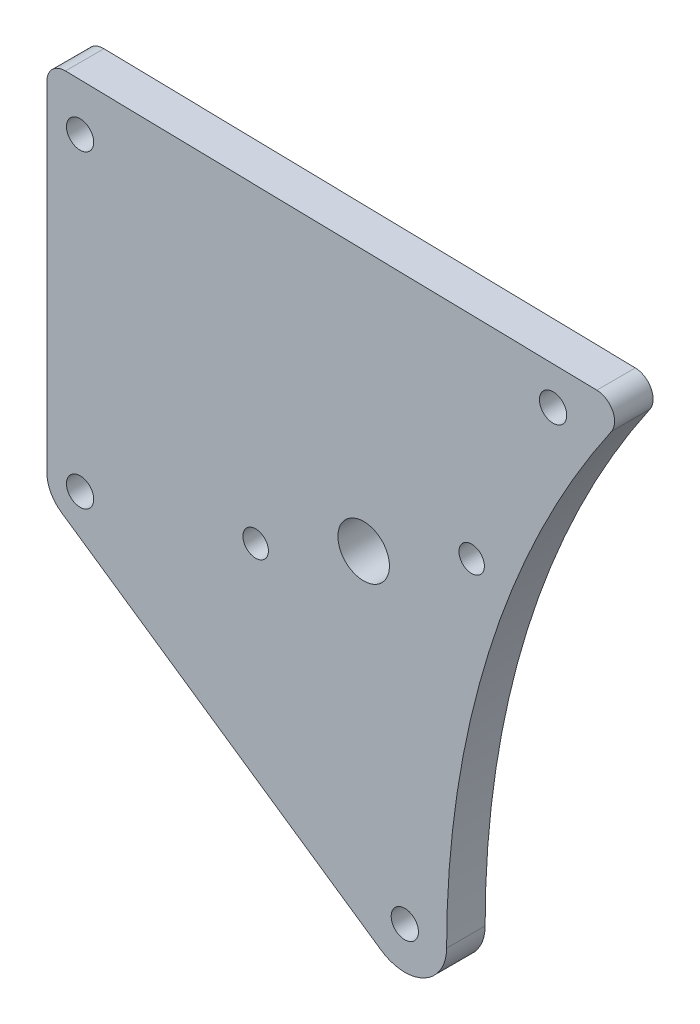
ISO-10303-21;
HEADER;
FILE_DESCRIPTION(('STEP AP214'),'2;1');
FILE_NAME('part.step','',(''),(''),'','','');
FILE_SCHEMA(('AUTOMOTIVE_DESIGN { 1 0 10303 214 1 1 1 1 }'));
ENDSEC;
DATA;
#1=APPLICATION_CONTEXT('core data for automotive mechanical design processes');
#2=APPLICATION_PROTOCOL_DEFINITION('international standard','automotive_design',2000,#1);
#3=PRODUCT_CONTEXT('',#1,'mechanical');
#4=PRODUCT('Part','Part','',(#3));
#5=PRODUCT_RELATED_PRODUCT_CATEGORY('part','',(#4));
#6=PRODUCT_DEFINITION_FORMATION('','',#4);
#7=PRODUCT_DEFINITION_CONTEXT('part definition',#1,'design');
#8=PRODUCT_DEFINITION('design','',#6,#7);
#9=PRODUCT_DEFINITION_SHAPE('','',#8);
#10=(LENGTH_UNIT() NAMED_UNIT(*) SI_UNIT(.MILLI.,.METRE.));
#11=(NAMED_UNIT(*) PLANE_ANGLE_UNIT() SI_UNIT($,.RADIAN.));
#12=(NAMED_UNIT(*) SI_UNIT($,.STERADIAN.) SOLID_ANGLE_UNIT());
#13=UNCERTAINTY_MEASURE_WITH_UNIT(LENGTH_MEASURE(1.E-05),#10,'distance_accuracy_value','');
#14=(GEOMETRIC_REPRESENTATION_CONTEXT(3) GLOBAL_UNCERTAINTY_ASSIGNED_CONTEXT((#13)) GLOBAL_UNIT_ASSIGNED_CONTEXT((#10,
#11,#12)) REPRESENTATION_CONTEXT('',''));
#15=CARTESIAN_POINT('',(0.,0.,0.));
#16=DIRECTION('',(0.,0.,1.));
#17=DIRECTION('',(1.,0.,0.));
#18=AXIS2_PLACEMENT_3D('',#15,#16,#17);
#19=CARTESIAN_POINT('',(-216.986286007672,90.8582156499784,6.35));
#20=DIRECTION('',(0.,0.,1.));
#21=DIRECTION('',(1.,0.,0.));
#22=AXIS2_PLACEMENT_3D('',#19,#20,#21);
#23=PLANE('',#22);
#24=CARTESIAN_POINT('',(-136.51,86.,6.35));
#25=DIRECTION('',(0.,0.,1.));
#26=DIRECTION('',(1.,0.,0.));
#27=AXIS2_PLACEMENT_3D('',#24,#25,#26);
#28=CIRCLE('',#27,2.248);
#29=CARTESIAN_POINT('',(-134.262,86.,6.35));
#30=VERTEX_POINT('',#29);
#31=EDGE_CURVE('E203',#30,#30,#28,.T.);
#32=ORIENTED_EDGE('',*,*,#31,.F.);
#33=EDGE_LOOP('',(#32));
#34=FACE_BOUND('',#33,.T.);
#35=CARTESIAN_POINT('',(-214.51,35.,6.35));
#36=DIRECTION('',(0.,0.,1.));
#37=DIRECTION('',(1.,0.,0.));
#38=AXIS2_PLACEMENT_3D('',#35,#36,#37);
#39=CIRCLE('',#38,2.248);
#40=CARTESIAN_POINT('',(-212.262,35.,6.35));
#41=VERTEX_POINT('',#40);
#42=EDGE_CURVE('E191',#41,#41,#39,.T.);
#43=ORIENTED_EDGE('',*,*,#42,.F.);
#44=EDGE_LOOP('',(#43));
#45=FACE_BOUND('',#44,.T.);
#46=CARTESIAN_POINT('',(-149.938627554827,57.6753742058202,6.35));
#47=DIRECTION('',(0.,0.,1.));
#48=DIRECTION('',(1.,0.,0.));
#49=AXIS2_PLACEMENT_3D('',#46,#47,#48);
#50=CIRCLE('',#49,2.10000000000002);
#51=CARTESIAN_POINT('',(-147.838627554827,57.6753742058202,6.35));
#52=VERTEX_POINT('',#51);
#53=EDGE_CURVE('E179',#52,#52,#50,.T.);
#54=ORIENTED_EDGE('',*,*,#53,.F.);
#55=EDGE_LOOP('',(#54));
#56=FACE_BOUND('',#55,.T.);
#57=CARTESIAN_POINT('',(-216.986286007672,90.8582156499784,6.35));
#58=DIRECTION('',(0.,0.,1.));
#59=DIRECTION('',(1.,0.,0.));
#60=AXIS2_PLACEMENT_3D('',#57,#58,#59);
#61=CIRCLE('',#60,3.);
#62=CARTESIAN_POINT('',(-216.925548391098,93.857600743949,6.35));
#63=VERTEX_POINT('',#62);
#64=CARTESIAN_POINT('',(-219.986286007672,90.8582156499784,6.35));
#65=VERTEX_POINT('',#64);
#66=EDGE_CURVE('E142',#63,#65,#61,.T.);
#67=ORIENTED_EDGE('',*,*,#66,.T.);
#68=DIRECTION('',(0.,-1.,0.));
#69=VECTOR('',#68,1.);
#70=CARTESIAN_POINT('',(-219.986286007672,90.8582156499784,6.35));
#71=LINE('',#70,#69);
#72=CARTESIAN_POINT('',(-219.986286007672,35.,6.35));
#73=VERTEX_POINT('',#72);
#74=EDGE_CURVE('E90',#65,#73,#71,.T.);
#75=ORIENTED_EDGE('',*,*,#74,.T.);
#76=CARTESIAN_POINT('',(-214.51,35.,6.35));
#77=DIRECTION('',(0.,0.,1.));
#78=DIRECTION('',(1.,0.,0.));
#79=AXIS2_PLACEMENT_3D('',#76,#77,#78);
#80=CIRCLE('',#79,5.47628600767153);
#81=CARTESIAN_POINT('',(-217.606823935587,30.4834316179434,6.35));
#82=VERTEX_POINT('',#81);
#83=EDGE_CURVE('E157',#73,#82,#80,.T.);
#84=ORIENTED_EDGE('',*,*,#83,.T.);
#85=DIRECTION('',(0.824750273402356,-0.565497114513186,0.));
#86=VECTOR('',#85,1.);
#87=CARTESIAN_POINT('',(-164.857630570775,-5.68450624480277,6.35));
#88=LINE('',#87,#86);
#89=CARTESIAN_POINT('',(-164.857630570775,-5.68450624480277,6.35));
#90=VERTEX_POINT('',#89);
#91=EDGE_CURVE('E170',#82,#90,#88,.T.);
#92=ORIENTED_EDGE('',*,*,#91,.T.);
#93=CARTESIAN_POINT('',(-160.96,0.,6.35));
#94=DIRECTION('',(0.,0.,1.));
#95=DIRECTION('',(1.,0.,0.));
#96=AXIS2_PLACEMENT_3D('',#93,#94,#95);
#97=CIRCLE('',#96,6.89239692077018);
#98=CARTESIAN_POINT('',(-154.06760307923,0.,6.35));
#99=VERTEX_POINT('',#98);
#100=EDGE_CURVE('E109',#90,#99,#97,.T.);
#101=ORIENTED_EDGE('',*,*,#100,.T.);
#102=CARTESIAN_POINT('',(0.,3.74716311865027E-13,6.35));
#103=DIRECTION('',(0.,0.,-1.));
#104=DIRECTION('',(1.,0.,0.));
#105=AXIS2_PLACEMENT_3D('',#102,#103,#104);
#106=CIRCLE('',#105,154.06760307923);
#107=CARTESIAN_POINT('',(-126.890346886855,87.3822990399818,6.35));
#108=VERTEX_POINT('',#107);
#109=EDGE_CURVE('E103',#99,#108,#106,.T.);
#110=ORIENTED_EDGE('',*,*,#109,.T.);
#111=CARTESIAN_POINT('',(-129.361152124637,89.0838046899732,6.35));
#112=DIRECTION('',(0.,0.,1.));
#113=DIRECTION('',(1.,0.,0.));
#114=AXIS2_PLACEMENT_3D('',#111,#112,#113);
#115=CIRCLE('',#114,3.00000000000001);
#116=CARTESIAN_POINT('',(-129.300414508063,92.0831897839438,6.35));
#117=VERTEX_POINT('',#116);
#118=EDGE_CURVE('E107',#108,#117,#115,.T.);
#119=ORIENTED_EDGE('',*,*,#118,.T.);
#120=DIRECTION('',(-0.999795031323528,0.0202458721912746,0.));
#121=VECTOR('',#120,1.);
#122=CARTESIAN_POINT('',(-129.300414508063,92.0831897839438,6.35));
#123=LINE('',#122,#121);
#124=EDGE_CURVE('E47',#117,#63,#123,.T.);
#125=ORIENTED_EDGE('',*,*,#124,.T.);
#126=EDGE_LOOP('',(#67,#75,#84,#92,#101,#110,#119,#125));
#127=FACE_BOUND('',#126,.T.);
#128=CARTESIAN_POINT('',(-185.554258913543,42.0468556585449,6.35));
#129=DIRECTION('',(0.,0.,1.));
#130=DIRECTION('',(1.,0.,0.));
#131=AXIS2_PLACEMENT_3D('',#128,#129,#130);
#132=CIRCLE('',#131,2.10000000000002);
#133=CARTESIAN_POINT('',(-183.454258913543,42.0468556585449,6.35));
#134=VERTEX_POINT('',#133);
#135=EDGE_CURVE('E131',#134,#134,#132,.T.);
#136=ORIENTED_EDGE('',*,*,#135,.F.);
#137=EDGE_LOOP('',(#136));
#138=FACE_BOUND('',#137,.T.);
#139=CARTESIAN_POINT('',(-167.746443234185,49.8611149321826,6.35));
#140=DIRECTION('',(0.,0.,1.));
#141=DIRECTION('',(1.,0.,0.));
#142=AXIS2_PLACEMENT_3D('',#139,#140,#141);
#143=CIRCLE('',#142,4.24882839306984);
#144=CARTESIAN_POINT('',(-163.497614841115,49.8611149321826,6.35));
#145=VERTEX_POINT('',#144);
#146=EDGE_CURVE('E185',#145,#145,#143,.T.);
#147=ORIENTED_EDGE('',*,*,#146,.F.);
#148=EDGE_LOOP('',(#147));
#149=FACE_BOUND('',#148,.T.);
#150=CARTESIAN_POINT('',(-214.51,86.,6.35));
#151=DIRECTION('',(0.,0.,1.));
#152=DIRECTION('',(1.,0.,0.));
#153=AXIS2_PLACEMENT_3D('',#150,#151,#152);
#154=CIRCLE('',#153,2.248);
#155=CARTESIAN_POINT('',(-212.262,86.,6.35));
#156=VERTEX_POINT('',#155);
#157=EDGE_CURVE('E197',#156,#156,#154,.T.);
#158=ORIENTED_EDGE('',*,*,#157,.F.);
#159=EDGE_LOOP('',(#158));
#160=FACE_BOUND('',#159,.T.);
#161=CARTESIAN_POINT('',(-160.96,0.,6.35));
#162=DIRECTION('',(0.,0.,1.));
#163=DIRECTION('',(1.,0.,0.));
#164=AXIS2_PLACEMENT_3D('',#161,#162,#163);
#165=CIRCLE('',#164,2.248);
#166=CARTESIAN_POINT('',(-158.712,0.,6.35));
#167=VERTEX_POINT('',#166);
#168=EDGE_CURVE('E209',#167,#167,#165,.T.);
#169=ORIENTED_EDGE('',*,*,#168,.F.);
#170=EDGE_LOOP('',(#169));
#171=FACE_BOUND('',#170,.T.);
#172=ADVANCED_FACE('F30',(#34,#45,#56,#127,#138,#149,#160,#171),#23,.T.);
#173=CARTESIAN_POINT('',(-216.986286007672,90.8582156499784,0.));
#174=DIRECTION('',(0.,0.,1.));
#175=DIRECTION('',(1.,0.,0.));
#176=AXIS2_PLACEMENT_3D('',#173,#174,#175);
#177=PLANE('',#176);
#178=CARTESIAN_POINT('',(-216.986286007672,90.8582156499784,0.));
#179=DIRECTION('',(0.,0.,1.));
#180=DIRECTION('',(1.,0.,0.));
#181=AXIS2_PLACEMENT_3D('',#178,#179,#180);
#182=CIRCLE('',#181,3.);
#183=CARTESIAN_POINT('',(-216.925548391098,93.857600743949,0.));
#184=VERTEX_POINT('',#183);
#185=CARTESIAN_POINT('',(-219.986286007672,90.8582156499784,0.));
#186=VERTEX_POINT('',#185);
#187=EDGE_CURVE('E127',#184,#186,#182,.T.);
#188=ORIENTED_EDGE('',*,*,#187,.F.);
#189=DIRECTION('',(-0.999795031323528,0.0202458721912746,0.));
#190=VECTOR('',#189,1.);
#191=CARTESIAN_POINT('',(-129.300414508063,92.0831897839438,0.));
#192=LINE('',#191,#190);
#193=CARTESIAN_POINT('',(-129.300414508063,92.0831897839438,0.));
#194=VERTEX_POINT('',#193);
#195=EDGE_CURVE('E82',#194,#184,#192,.T.);
#196=ORIENTED_EDGE('',*,*,#195,.F.);
#197=CARTESIAN_POINT('',(-129.361152124637,89.0838046899732,0.));
#198=DIRECTION('',(0.,0.,1.));
#199=DIRECTION('',(1.,0.,0.));
#200=AXIS2_PLACEMENT_3D('',#197,#198,#199);
#201=CIRCLE('',#200,3.00000000000001);
#202=CARTESIAN_POINT('',(-126.890346886855,87.3822990399818,0.));
#203=VERTEX_POINT('',#202);
#204=EDGE_CURVE('E76',#203,#194,#201,.T.);
#205=ORIENTED_EDGE('',*,*,#204,.F.);
#206=CARTESIAN_POINT('',(0.,3.74716311865027E-13,0.));
#207=DIRECTION('',(0.,0.,-1.));
#208=DIRECTION('',(1.,0.,0.));
#209=AXIS2_PLACEMENT_3D('',#206,#207,#208);
#210=CIRCLE('',#209,154.06760307923);
#211=CARTESIAN_POINT('',(-154.06760307923,0.,0.));
#212=VERTEX_POINT('',#211);
#213=EDGE_CURVE('E117',#212,#203,#210,.T.);
#214=ORIENTED_EDGE('',*,*,#213,.F.);
#215=CARTESIAN_POINT('',(-160.96,0.,0.));
#216=DIRECTION('',(0.,0.,1.));
#217=DIRECTION('',(1.,0.,0.));
#218=AXIS2_PLACEMENT_3D('',#215,#216,#217);
#219=CIRCLE('',#218,6.89239692077018);
#220=CARTESIAN_POINT('',(-164.857630570775,-5.68450624480277,0.));
#221=VERTEX_POINT('',#220);
#222=EDGE_CURVE('E137',#221,#212,#219,.T.);
#223=ORIENTED_EDGE('',*,*,#222,.F.);
#224=DIRECTION('',(0.824750273402356,-0.565497114513186,0.));
#225=VECTOR('',#224,1.);
#226=CARTESIAN_POINT('',(-164.857630570775,-5.68450624480277,0.));
#227=LINE('',#226,#225);
#228=CARTESIAN_POINT('',(-217.606823935587,30.4834316179434,0.));
#229=VERTEX_POINT('',#228);
#230=EDGE_CURVE('E135',#229,#221,#227,.T.);
#231=ORIENTED_EDGE('',*,*,#230,.F.);
#232=CARTESIAN_POINT('',(-214.51,35.,0.));
#233=DIRECTION('',(0.,0.,1.));
#234=DIRECTION('',(1.,0.,0.));
#235=AXIS2_PLACEMENT_3D('',#232,#233,#234);
#236=CIRCLE('',#235,5.47628600767153);
#237=CARTESIAN_POINT('',(-219.986286007672,35.,0.));
#238=VERTEX_POINT('',#237);
#239=EDGE_CURVE('E133',#238,#229,#236,.T.);
#240=ORIENTED_EDGE('',*,*,#239,.F.);
#241=DIRECTION('',(0.,-1.,0.));
#242=VECTOR('',#241,1.);
#243=CARTESIAN_POINT('',(-219.986286007672,90.8582156499784,0.));
#244=LINE('',#243,#242);
#245=EDGE_CURVE('E130',#186,#238,#244,.T.);
#246=ORIENTED_EDGE('',*,*,#245,.F.);
#247=EDGE_LOOP('',(#188,#196,#205,#214,#223,#231,#240,#246));
#248=FACE_BOUND('',#247,.T.);
#249=CARTESIAN_POINT('',(-185.554258913543,42.0468556585449,0.));
#250=DIRECTION('',(0.,0.,1.));
#251=DIRECTION('',(1.,0.,0.));
#252=AXIS2_PLACEMENT_3D('',#249,#250,#251);
#253=CIRCLE('',#252,2.10000000000002);
#254=CARTESIAN_POINT('',(-183.454258913543,42.0468556585449,0.));
#255=VERTEX_POINT('',#254);
#256=EDGE_CURVE('E176',#255,#255,#253,.T.);
#257=ORIENTED_EDGE('',*,*,#256,.T.);
#258=EDGE_LOOP('',(#257));
#259=FACE_BOUND('',#258,.T.);
#260=CARTESIAN_POINT('',(-149.938627554827,57.6753742058202,0.));
#261=DIRECTION('',(0.,0.,1.));
#262=DIRECTION('',(1.,0.,0.));
#263=AXIS2_PLACEMENT_3D('',#260,#261,#262);
#264=CIRCLE('',#263,2.10000000000002);
#265=CARTESIAN_POINT('',(-147.838627554827,57.6753742058202,0.));
#266=VERTEX_POINT('',#265);
#267=EDGE_CURVE('E182',#266,#266,#264,.T.);
#268=ORIENTED_EDGE('',*,*,#267,.T.);
#269=EDGE_LOOP('',(#268));
#270=FACE_BOUND('',#269,.T.);
#271=CARTESIAN_POINT('',(-167.746443234185,49.8611149321826,0.));
#272=DIRECTION('',(0.,0.,1.));
#273=DIRECTION('',(1.,0.,0.));
#274=AXIS2_PLACEMENT_3D('',#271,#272,#273);
#275=CIRCLE('',#274,4.24882839306984);
#276=CARTESIAN_POINT('',(-163.497614841115,49.8611149321826,0.));
#277=VERTEX_POINT('',#276);
#278=EDGE_CURVE('E188',#277,#277,#275,.T.);
#279=ORIENTED_EDGE('',*,*,#278,.T.);
#280=EDGE_LOOP('',(#279));
#281=FACE_BOUND('',#280,.T.);
#282=CARTESIAN_POINT('',(-214.51,35.,0.));
#283=DIRECTION('',(0.,0.,1.));
#284=DIRECTION('',(1.,0.,0.));
#285=AXIS2_PLACEMENT_3D('',#282,#283,#284);
#286=CIRCLE('',#285,2.248);
#287=CARTESIAN_POINT('',(-212.262,35.,0.));
#288=VERTEX_POINT('',#287);
#289=EDGE_CURVE('E194',#288,#288,#286,.T.);
#290=ORIENTED_EDGE('',*,*,#289,.T.);
#291=EDGE_LOOP('',(#290));
#292=FACE_BOUND('',#291,.T.);
#293=CARTESIAN_POINT('',(-214.51,86.,0.));
#294=DIRECTION('',(0.,0.,1.));
#295=DIRECTION('',(1.,0.,0.));
#296=AXIS2_PLACEMENT_3D('',#293,#294,#295);
#297=CIRCLE('',#296,2.248);
#298=CARTESIAN_POINT('',(-212.262,86.,0.));
#299=VERTEX_POINT('',#298);
#300=EDGE_CURVE('E200',#299,#299,#297,.T.);
#301=ORIENTED_EDGE('',*,*,#300,.T.);
#302=EDGE_LOOP('',(#301));
#303=FACE_BOUND('',#302,.T.);
#304=CARTESIAN_POINT('',(-136.51,86.,0.));
#305=DIRECTION('',(0.,0.,1.));
#306=DIRECTION('',(1.,0.,0.));
#307=AXIS2_PLACEMENT_3D('',#304,#305,#306);
#308=CIRCLE('',#307,2.248);
#309=CARTESIAN_POINT('',(-134.262,86.,0.));
#310=VERTEX_POINT('',#309);
#311=EDGE_CURVE('E206',#310,#310,#308,.T.);
#312=ORIENTED_EDGE('',*,*,#311,.T.);
#313=EDGE_LOOP('',(#312));
#314=FACE_BOUND('',#313,.T.);
#315=CARTESIAN_POINT('',(-160.96,0.,0.));
#316=DIRECTION('',(0.,0.,1.));
#317=DIRECTION('',(1.,0.,0.));
#318=AXIS2_PLACEMENT_3D('',#315,#316,#317);
#319=CIRCLE('',#318,2.248);
#320=CARTESIAN_POINT('',(-158.712,0.,0.));
#321=VERTEX_POINT('',#320);
#322=EDGE_CURVE('E212',#321,#321,#319,.T.);
#323=ORIENTED_EDGE('',*,*,#322,.T.);
#324=EDGE_LOOP('',(#323));
#325=FACE_BOUND('',#324,.T.);
#326=ADVANCED_FACE('F161',(#248,#259,#270,#281,#292,#303,#314,#325),#177,.F.);
#327=CARTESIAN_POINT('',(-216.986286007672,90.8582156499784,6.35));
#328=DIRECTION('',(0.,0.,-1.));
#329=DIRECTION('',(-1.,0.,0.));
#330=AXIS2_PLACEMENT_3D('',#327,#328,#329);
#331=CYLINDRICAL_SURFACE('',#330,3.);
#332=ORIENTED_EDGE('',*,*,#187,.T.);
#333=DIRECTION('',(0.,0.,-1.));
#334=VECTOR('',#333,1.);
#335=CARTESIAN_POINT('',(-219.986286007672,90.8582156499784,6.35));
#336=LINE('',#335,#334);
#337=EDGE_CURVE('E11',#65,#186,#336,.T.);
#338=ORIENTED_EDGE('',*,*,#337,.F.);
#339=ORIENTED_EDGE('',*,*,#66,.F.);
#340=DIRECTION('',(0.,0.,-1.));
#341=VECTOR('',#340,1.);
#342=CARTESIAN_POINT('',(-216.925548391098,93.857600743949,6.35));
#343=LINE('',#342,#341);
#344=EDGE_CURVE('E123',#63,#184,#343,.T.);
#345=ORIENTED_EDGE('',*,*,#344,.T.);
#346=EDGE_LOOP('',(#332,#338,#339,#345));
#347=FACE_BOUND('',#346,.T.);
#348=ADVANCED_FACE('F32',(#347),#331,.T.);
#349=CARTESIAN_POINT('',(-219.986286007672,90.8582156499784,6.35));
#350=DIRECTION('',(1.,0.,0.));
#351=DIRECTION('',(0.,0.,-1.));
#352=AXIS2_PLACEMENT_3D('',#349,#350,#351);
#353=PLANE('',#352);
#354=ORIENTED_EDGE('',*,*,#245,.T.);
#355=DIRECTION('',(0.,0.,-1.));
#356=VECTOR('',#355,1.);
#357=CARTESIAN_POINT('',(-219.986286007672,35.,6.35));
#358=LINE('',#357,#356);
#359=EDGE_CURVE('E39',#73,#238,#358,.T.);
#360=ORIENTED_EDGE('',*,*,#359,.F.);
#361=ORIENTED_EDGE('',*,*,#74,.F.);
#362=ORIENTED_EDGE('',*,*,#337,.T.);
#363=EDGE_LOOP('',(#354,#360,#361,#362));
#364=FACE_BOUND('',#363,.T.);
#365=ADVANCED_FACE('F246',(#364),#353,.F.);
#366=CARTESIAN_POINT('',(-214.51,35.,6.35));
#367=DIRECTION('',(0.,0.,-1.));
#368=DIRECTION('',(-1.,0.,0.));
#369=AXIS2_PLACEMENT_3D('',#366,#367,#368);
#370=CYLINDRICAL_SURFACE('',#369,5.47628600767153);
#371=ORIENTED_EDGE('',*,*,#239,.T.);
#372=DIRECTION('',(0.,0.,-1.));
#373=VECTOR('',#372,1.);
#374=CARTESIAN_POINT('',(-217.606823935587,30.4834316179434,6.35));
#375=LINE('',#374,#373);
#376=EDGE_CURVE('E149',#82,#229,#375,.T.);
#377=ORIENTED_EDGE('',*,*,#376,.F.);
#378=ORIENTED_EDGE('',*,*,#83,.F.);
#379=ORIENTED_EDGE('',*,*,#359,.T.);
#380=EDGE_LOOP('',(#371,#377,#378,#379));
#381=FACE_BOUND('',#380,.T.);
#382=ADVANCED_FACE('F155',(#381),#370,.T.);
#383=CARTESIAN_POINT('',(-164.857630570775,-5.68450624480277,6.35));
#384=DIRECTION('',(0.565497114513186,0.824750273402356,0.));
#385=DIRECTION('',(-0.824750273402356,0.565497114513186,0.));
#386=AXIS2_PLACEMENT_3D('',#383,#384,#385);
#387=PLANE('',#386);
#388=ORIENTED_EDGE('',*,*,#230,.T.);
#389=DIRECTION('',(0.,0.,-1.));
#390=VECTOR('',#389,1.);
#391=CARTESIAN_POINT('',(-164.857630570775,-5.68450624480277,6.35));
#392=LINE('',#391,#390);
#393=EDGE_CURVE('E146',#90,#221,#392,.T.);
#394=ORIENTED_EDGE('',*,*,#393,.F.);
#395=ORIENTED_EDGE('',*,*,#91,.F.);
#396=ORIENTED_EDGE('',*,*,#376,.T.);
#397=EDGE_LOOP('',(#388,#394,#395,#396));
#398=FACE_BOUND('',#397,.T.);
#399=ADVANCED_FACE('F166',(#398),#387,.F.);
#400=CARTESIAN_POINT('',(-160.96,0.,6.35));
#401=DIRECTION('',(0.,0.,-1.));
#402=DIRECTION('',(-1.,0.,0.));
#403=AXIS2_PLACEMENT_3D('',#400,#401,#402);
#404=CYLINDRICAL_SURFACE('',#403,6.89239692077018);
#405=ORIENTED_EDGE('',*,*,#222,.T.);
#406=DIRECTION('',(0.,0.,-1.));
#407=VECTOR('',#406,1.);
#408=CARTESIAN_POINT('',(-154.06760307923,0.,6.35));
#409=LINE('',#408,#407);
#410=EDGE_CURVE('E118',#99,#212,#409,.T.);
#411=ORIENTED_EDGE('',*,*,#410,.F.);
#412=ORIENTED_EDGE('',*,*,#100,.F.);
#413=ORIENTED_EDGE('',*,*,#393,.T.);
#414=EDGE_LOOP('',(#405,#411,#412,#413));
#415=FACE_BOUND('',#414,.T.);
#416=ADVANCED_FACE('F169',(#415),#404,.T.);
#417=CARTESIAN_POINT('',(0.,3.74716311865027E-13,6.35));
#418=DIRECTION('',(0.,0.,-1.));
#419=DIRECTION('',(-1.,0.,0.));
#420=AXIS2_PLACEMENT_3D('',#417,#418,#419);
#421=CYLINDRICAL_SURFACE('',#420,154.06760307923);
#422=ORIENTED_EDGE('',*,*,#213,.T.);
#423=DIRECTION('',(0.,0.,-1.));
#424=VECTOR('',#423,1.);
#425=CARTESIAN_POINT('',(-126.890346886855,87.3822990399818,6.35));
#426=LINE('',#425,#424);
#427=EDGE_CURVE('E114',#108,#203,#426,.T.);
#428=ORIENTED_EDGE('',*,*,#427,.F.);
#429=ORIENTED_EDGE('',*,*,#109,.F.);
#430=ORIENTED_EDGE('',*,*,#410,.T.);
#431=EDGE_LOOP('',(#422,#428,#429,#430));
#432=FACE_BOUND('',#431,.T.);
#433=ADVANCED_FACE('F115',(#432),#421,.F.);
#434=CARTESIAN_POINT('',(-129.361152124637,89.0838046899732,6.35));
#435=DIRECTION('',(0.,0.,-1.));
#436=DIRECTION('',(-1.,0.,0.));
#437=AXIS2_PLACEMENT_3D('',#434,#435,#436);
#438=CYLINDRICAL_SURFACE('',#437,3.00000000000001);
#439=ORIENTED_EDGE('',*,*,#204,.T.);
#440=DIRECTION('',(0.,0.,-1.));
#441=VECTOR('',#440,1.);
#442=CARTESIAN_POINT('',(-129.300414508063,92.0831897839438,6.35));
#443=LINE('',#442,#441);
#444=EDGE_CURVE('E119',#117,#194,#443,.T.);
#445=ORIENTED_EDGE('',*,*,#444,.F.);
#446=ORIENTED_EDGE('',*,*,#118,.F.);
#447=ORIENTED_EDGE('',*,*,#427,.T.);
#448=EDGE_LOOP('',(#439,#445,#446,#447));
#449=FACE_BOUND('',#448,.T.);
#450=ADVANCED_FACE('F121',(#449),#438,.T.);
#451=CARTESIAN_POINT('',(-129.300414508063,92.0831897839438,6.35));
#452=DIRECTION('',(-0.0202458721912746,-0.999795031323528,0.));
#453=DIRECTION('',(0.999795031323528,-0.0202458721912746,0.));
#454=AXIS2_PLACEMENT_3D('',#451,#452,#453);
#455=PLANE('',#454);
#456=ORIENTED_EDGE('',*,*,#195,.T.);
#457=ORIENTED_EDGE('',*,*,#344,.F.);
#458=ORIENTED_EDGE('',*,*,#124,.F.);
#459=ORIENTED_EDGE('',*,*,#444,.T.);
#460=EDGE_LOOP('',(#456,#457,#458,#459));
#461=FACE_BOUND('',#460,.T.);
#462=ADVANCED_FACE('F234',(#461),#455,.F.);
#463=CARTESIAN_POINT('',(-185.554258913543,42.0468556585449,6.35));
#464=DIRECTION('',(0.,0.,-1.));
#465=DIRECTION('',(-1.,0.,0.));
#466=AXIS2_PLACEMENT_3D('',#463,#464,#465);
#467=CYLINDRICAL_SURFACE('',#466,2.10000000000002);
#468=ORIENTED_EDGE('',*,*,#135,.T.);
#469=EDGE_LOOP('',(#468));
#470=FACE_BOUND('',#469,.T.);
#471=ORIENTED_EDGE('',*,*,#256,.F.);
#472=EDGE_LOOP('',(#471));
#473=FACE_BOUND('',#472,.T.);
#474=ADVANCED_FACE('F231',(#470,#473),#467,.F.);
#475=CARTESIAN_POINT('',(-149.938627554827,57.6753742058202,6.35));
#476=DIRECTION('',(0.,0.,-1.));
#477=DIRECTION('',(-1.,0.,0.));
#478=AXIS2_PLACEMENT_3D('',#475,#476,#477);
#479=CYLINDRICAL_SURFACE('',#478,2.10000000000002);
#480=ORIENTED_EDGE('',*,*,#53,.T.);
#481=EDGE_LOOP('',(#480));
#482=FACE_BOUND('',#481,.T.);
#483=ORIENTED_EDGE('',*,*,#267,.F.);
#484=EDGE_LOOP('',(#483));
#485=FACE_BOUND('',#484,.T.);
#486=ADVANCED_FACE('F310',(#482,#485),#479,.F.);
#487=CARTESIAN_POINT('',(-167.746443234185,49.8611149321826,6.35));
#488=DIRECTION('',(0.,0.,-1.));
#489=DIRECTION('',(-1.,0.,0.));
#490=AXIS2_PLACEMENT_3D('',#487,#488,#489);
#491=CYLINDRICAL_SURFACE('',#490,4.24882839306984);
#492=ORIENTED_EDGE('',*,*,#146,.T.);
#493=EDGE_LOOP('',(#492));
#494=FACE_BOUND('',#493,.T.);
#495=ORIENTED_EDGE('',*,*,#278,.F.);
#496=EDGE_LOOP('',(#495));
#497=FACE_BOUND('',#496,.T.);
#498=ADVANCED_FACE('F318',(#494,#497),#491,.F.);
#499=CARTESIAN_POINT('',(-214.51,35.,6.35));
#500=DIRECTION('',(0.,0.,-1.));
#501=DIRECTION('',(-1.,0.,0.));
#502=AXIS2_PLACEMENT_3D('',#499,#500,#501);
#503=CYLINDRICAL_SURFACE('',#502,2.248);
#504=ORIENTED_EDGE('',*,*,#42,.T.);
#505=EDGE_LOOP('',(#504));
#506=FACE_BOUND('',#505,.T.);
#507=ORIENTED_EDGE('',*,*,#289,.F.);
#508=EDGE_LOOP('',(#507));
#509=FACE_BOUND('',#508,.T.);
#510=ADVANCED_FACE('F326',(#506,#509),#503,.F.);
#511=CARTESIAN_POINT('',(-214.51,86.,6.35));
#512=DIRECTION('',(0.,0.,-1.));
#513=DIRECTION('',(-1.,0.,0.));
#514=AXIS2_PLACEMENT_3D('',#511,#512,#513);
#515=CYLINDRICAL_SURFACE('',#514,2.248);
#516=ORIENTED_EDGE('',*,*,#157,.T.);
#517=EDGE_LOOP('',(#516));
#518=FACE_BOUND('',#517,.T.);
#519=ORIENTED_EDGE('',*,*,#300,.F.);
#520=EDGE_LOOP('',(#519));
#521=FACE_BOUND('',#520,.T.);
#522=ADVANCED_FACE('F335',(#518,#521),#515,.F.);
#523=CARTESIAN_POINT('',(-136.51,86.,6.35));
#524=DIRECTION('',(0.,0.,-1.));
#525=DIRECTION('',(-1.,0.,0.));
#526=AXIS2_PLACEMENT_3D('',#523,#524,#525);
#527=CYLINDRICAL_SURFACE('',#526,2.248);
#528=ORIENTED_EDGE('',*,*,#31,.T.);
#529=EDGE_LOOP('',(#528));
#530=FACE_BOUND('',#529,.T.);
#531=ORIENTED_EDGE('',*,*,#311,.F.);
#532=EDGE_LOOP('',(#531));
#533=FACE_BOUND('',#532,.T.);
#534=ADVANCED_FACE('F344',(#530,#533),#527,.F.);
#535=CARTESIAN_POINT('',(-160.96,0.,6.35));
#536=DIRECTION('',(0.,0.,-1.));
#537=DIRECTION('',(-1.,0.,0.));
#538=AXIS2_PLACEMENT_3D('',#535,#536,#537);
#539=CYLINDRICAL_SURFACE('',#538,2.248);
#540=ORIENTED_EDGE('',*,*,#168,.T.);
#541=EDGE_LOOP('',(#540));
#542=FACE_BOUND('',#541,.T.);
#543=ORIENTED_EDGE('',*,*,#322,.F.);
#544=EDGE_LOOP('',(#543));
#545=FACE_BOUND('',#544,.T.);
#546=ADVANCED_FACE('F218',(#542,#545),#539,.F.);
#547=CLOSED_SHELL('',(#172,#326,#348,#365,#382,#399,#416,#433,#450,#462,#474,#486,#498,#510,
#522,#534,#546));
#548=MANIFOLD_SOLID_BREP('B2',#547);
#549=ADVANCED_BREP_SHAPE_REPRESENTATION('',(#18,#548),#14);
#550=SHAPE_DEFINITION_REPRESENTATION(#9,#549);
ENDSEC;
END-ISO-10303-21;
